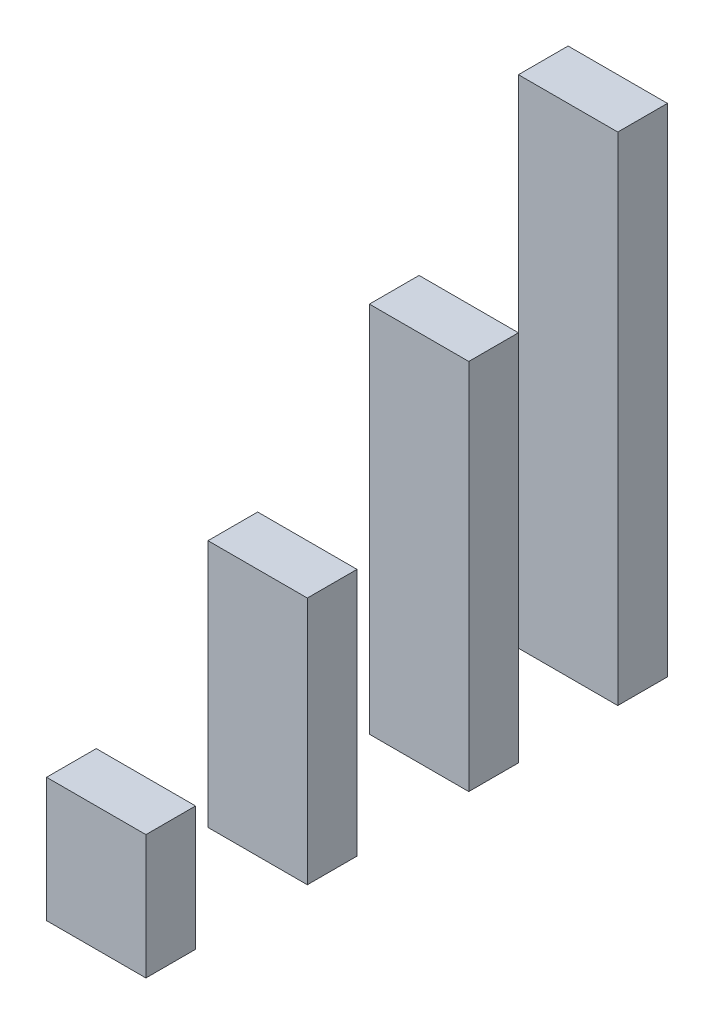
ISO-10303-21;
HEADER;
FILE_DESCRIPTION(('STEP AP214'),'2;1');
FILE_NAME('part.step','',(''),(''),'','','');
FILE_SCHEMA(('AUTOMOTIVE_DESIGN { 1 0 10303 214 1 1 1 1 }'));
ENDSEC;
DATA;
#1=APPLICATION_CONTEXT('core data for automotive mechanical design processes');
#2=APPLICATION_PROTOCOL_DEFINITION('international standard','automotive_design',2000,#1);
#3=PRODUCT_CONTEXT('',#1,'mechanical');
#4=PRODUCT('Part','Part','',(#3));
#5=PRODUCT_RELATED_PRODUCT_CATEGORY('part','',(#4));
#6=PRODUCT_DEFINITION_FORMATION('','',#4);
#7=PRODUCT_DEFINITION_CONTEXT('part definition',#1,'design');
#8=PRODUCT_DEFINITION('design','',#6,#7);
#9=PRODUCT_DEFINITION_SHAPE('','',#8);
#10=(LENGTH_UNIT() NAMED_UNIT(*) SI_UNIT(.MILLI.,.METRE.));
#11=(NAMED_UNIT(*) PLANE_ANGLE_UNIT() SI_UNIT($,.RADIAN.));
#12=(NAMED_UNIT(*) SI_UNIT($,.STERADIAN.) SOLID_ANGLE_UNIT());
#13=UNCERTAINTY_MEASURE_WITH_UNIT(LENGTH_MEASURE(1.E-05),#10,'distance_accuracy_value','');
#14=(GEOMETRIC_REPRESENTATION_CONTEXT(3) GLOBAL_UNCERTAINTY_ASSIGNED_CONTEXT((#13)) GLOBAL_UNIT_ASSIGNED_CONTEXT((#10,
#11,#12)) REPRESENTATION_CONTEXT('',''));
#15=CARTESIAN_POINT('',(0.,0.,0.));
#16=DIRECTION('',(0.,0.,1.));
#17=DIRECTION('',(1.,0.,0.));
#18=AXIS2_PLACEMENT_3D('',#15,#16,#17);
#19=CARTESIAN_POINT('',(-4.00000000000001,41.,-21.));
#20=DIRECTION('',(1.,0.,0.));
#21=DIRECTION('',(0.,0.,-1.));
#22=AXIS2_PLACEMENT_3D('',#19,#20,#21);
#23=PLANE('',#22);
#24=DIRECTION('',(0.,0.,1.));
#25=VECTOR('',#24,1.);
#26=CARTESIAN_POINT('',(-4.00000000000001,1.,-21.));
#27=LINE('',#26,#25);
#28=CARTESIAN_POINT('',(-4.00000000000001,1.,-21.));
#29=VERTEX_POINT('',#28);
#30=CARTESIAN_POINT('',(-4.00000000000001,1.,-17.));
#31=VERTEX_POINT('',#30);
#32=EDGE_CURVE('E109',#29,#31,#27,.T.);
#33=ORIENTED_EDGE('',*,*,#32,.T.);
#34=DIRECTION('',(0.,-1.,0.));
#35=VECTOR('',#34,1.);
#36=CARTESIAN_POINT('',(-4.00000000000001,41.,-17.));
#37=LINE('',#36,#35);
#38=CARTESIAN_POINT('',(-4.00000000000001,41.,-17.));
#39=VERTEX_POINT('',#38);
#40=EDGE_CURVE('E12',#39,#31,#37,.T.);
#41=ORIENTED_EDGE('',*,*,#40,.F.);
#42=DIRECTION('',(0.,0.,1.));
#43=VECTOR('',#42,1.);
#44=CARTESIAN_POINT('',(-4.00000000000001,41.,-21.));
#45=LINE('',#44,#43);
#46=CARTESIAN_POINT('',(-4.00000000000001,41.,-21.));
#47=VERTEX_POINT('',#46);
#48=EDGE_CURVE('E97',#47,#39,#45,.T.);
#49=ORIENTED_EDGE('',*,*,#48,.F.);
#50=DIRECTION('',(0.,-1.,0.));
#51=VECTOR('',#50,1.);
#52=CARTESIAN_POINT('',(-4.00000000000001,41.,-21.));
#53=LINE('',#52,#51);
#54=EDGE_CURVE('E105',#47,#29,#53,.T.);
#55=ORIENTED_EDGE('',*,*,#54,.T.);
#56=EDGE_LOOP('',(#33,#41,#49,#55));
#57=FACE_BOUND('',#56,.T.);
#58=ADVANCED_FACE('F46',(#57),#23,.F.);
#59=CARTESIAN_POINT('',(-4.00000000000001,41.,-17.));
#60=DIRECTION('',(0.,0.,-1.));
#61=DIRECTION('',(-1.,0.,0.));
#62=AXIS2_PLACEMENT_3D('',#59,#60,#61);
#63=PLANE('',#62);
#64=DIRECTION('',(1.,0.,0.));
#65=VECTOR('',#64,1.);
#66=CARTESIAN_POINT('',(-4.00000000000001,1.,-17.));
#67=LINE('',#66,#65);
#68=CARTESIAN_POINT('',(3.99999999999999,1.,-17.));
#69=VERTEX_POINT('',#68);
#70=EDGE_CURVE('E101',#31,#69,#67,.T.);
#71=ORIENTED_EDGE('',*,*,#70,.T.);
#72=DIRECTION('',(0.,-1.,0.));
#73=VECTOR('',#72,1.);
#74=CARTESIAN_POINT('',(3.99999999999999,41.,-17.));
#75=LINE('',#74,#73);
#76=CARTESIAN_POINT('',(3.99999999999999,41.,-17.));
#77=VERTEX_POINT('',#76);
#78=EDGE_CURVE('E54',#77,#69,#75,.T.);
#79=ORIENTED_EDGE('',*,*,#78,.F.);
#80=DIRECTION('',(1.,0.,0.));
#81=VECTOR('',#80,1.);
#82=CARTESIAN_POINT('',(-4.00000000000001,41.,-17.));
#83=LINE('',#82,#81);
#84=EDGE_CURVE('E92',#39,#77,#83,.T.);
#85=ORIENTED_EDGE('',*,*,#84,.F.);
#86=ORIENTED_EDGE('',*,*,#40,.T.);
#87=EDGE_LOOP('',(#71,#79,#85,#86));
#88=FACE_BOUND('',#87,.T.);
#89=ADVANCED_FACE('F100',(#88),#63,.F.);
#90=CARTESIAN_POINT('',(3.99999999999999,41.,-21.));
#91=DIRECTION('',(-1.,0.,0.));
#92=DIRECTION('',(0.,0.,1.));
#93=AXIS2_PLACEMENT_3D('',#90,#91,#92);
#94=PLANE('',#93);
#95=DIRECTION('',(0.,0.,-1.));
#96=VECTOR('',#95,1.);
#97=CARTESIAN_POINT('',(3.99999999999999,1.,-21.));
#98=LINE('',#97,#96);
#99=CARTESIAN_POINT('',(3.99999999999999,1.,-21.));
#100=VERTEX_POINT('',#99);
#101=EDGE_CURVE('E79',#69,#100,#98,.T.);
#102=ORIENTED_EDGE('',*,*,#101,.T.);
#103=DIRECTION('',(0.,-1.,0.));
#104=VECTOR('',#103,1.);
#105=CARTESIAN_POINT('',(3.99999999999999,41.,-21.));
#106=LINE('',#105,#104);
#107=CARTESIAN_POINT('',(3.99999999999999,41.,-21.));
#108=VERTEX_POINT('',#107);
#109=EDGE_CURVE('E102',#108,#100,#106,.T.);
#110=ORIENTED_EDGE('',*,*,#109,.F.);
#111=DIRECTION('',(0.,0.,-1.));
#112=VECTOR('',#111,1.);
#113=CARTESIAN_POINT('',(3.99999999999999,41.,-21.));
#114=LINE('',#113,#112);
#115=EDGE_CURVE('E95',#77,#108,#114,.T.);
#116=ORIENTED_EDGE('',*,*,#115,.F.);
#117=ORIENTED_EDGE('',*,*,#78,.T.);
#118=EDGE_LOOP('',(#102,#110,#116,#117));
#119=FACE_BOUND('',#118,.T.);
#120=ADVANCED_FACE('F103',(#119),#94,.F.);
#121=CARTESIAN_POINT('',(-4.00000000000001,41.,-21.));
#122=DIRECTION('',(0.,0.,1.));
#123=DIRECTION('',(1.,0.,0.));
#124=AXIS2_PLACEMENT_3D('',#121,#122,#123);
#125=PLANE('',#124);
#126=DIRECTION('',(-1.,0.,0.));
#127=VECTOR('',#126,1.);
#128=CARTESIAN_POINT('',(-4.00000000000001,1.,-21.));
#129=LINE('',#128,#127);
#130=EDGE_CURVE('E85',#100,#29,#129,.T.);
#131=ORIENTED_EDGE('',*,*,#130,.T.);
#132=ORIENTED_EDGE('',*,*,#54,.F.);
#133=DIRECTION('',(-1.,0.,0.));
#134=VECTOR('',#133,1.);
#135=CARTESIAN_POINT('',(-4.00000000000001,41.,-21.));
#136=LINE('',#135,#134);
#137=EDGE_CURVE('E62',#108,#47,#136,.T.);
#138=ORIENTED_EDGE('',*,*,#137,.F.);
#139=ORIENTED_EDGE('',*,*,#109,.T.);
#140=EDGE_LOOP('',(#131,#132,#138,#139));
#141=FACE_BOUND('',#140,.T.);
#142=ADVANCED_FACE('F116',(#141),#125,.F.);
#143=CARTESIAN_POINT('',(0.,41.,0.));
#144=DIRECTION('',(0.,1.,0.));
#145=DIRECTION('',(0.,0.,1.));
#146=AXIS2_PLACEMENT_3D('',#143,#144,#145);
#147=PLANE('',#146);
#148=ORIENTED_EDGE('',*,*,#48,.T.);
#149=ORIENTED_EDGE('',*,*,#84,.T.);
#150=ORIENTED_EDGE('',*,*,#115,.T.);
#151=ORIENTED_EDGE('',*,*,#137,.T.);
#152=EDGE_LOOP('',(#148,#149,#150,#151));
#153=FACE_BOUND('',#152,.T.);
#154=ADVANCED_FACE('F93',(#153),#147,.T.);
#155=CARTESIAN_POINT('',(0.,1.,0.));
#156=DIRECTION('',(0.,1.,0.));
#157=DIRECTION('',(0.,0.,1.));
#158=AXIS2_PLACEMENT_3D('',#155,#156,#157);
#159=PLANE('',#158);
#160=ORIENTED_EDGE('',*,*,#32,.F.);
#161=ORIENTED_EDGE('',*,*,#130,.F.);
#162=ORIENTED_EDGE('',*,*,#101,.F.);
#163=ORIENTED_EDGE('',*,*,#70,.F.);
#164=EDGE_LOOP('',(#160,#161,#162,#163));
#165=FACE_BOUND('',#164,.T.);
#166=ADVANCED_FACE('F119',(#165),#159,.F.);
#167=CLOSED_SHELL('',(#58,#89,#120,#142,#154,#166));
#168=MANIFOLD_SOLID_BREP('B2',#167);
#169=CARTESIAN_POINT('',(-4.00000000000001,31.,-9.));
#170=DIRECTION('',(1.,0.,0.));
#171=DIRECTION('',(0.,0.,-1.));
#172=AXIS2_PLACEMENT_3D('',#169,#170,#171);
#173=PLANE('',#172);
#174=DIRECTION('',(0.,0.,1.));
#175=VECTOR('',#174,1.);
#176=CARTESIAN_POINT('',(-4.00000000000001,1.,-9.));
#177=LINE('',#176,#175);
#178=CARTESIAN_POINT('',(-4.00000000000001,1.,-9.));
#179=VERTEX_POINT('',#178);
#180=CARTESIAN_POINT('',(-4.00000000000001,1.,-5.));
#181=VERTEX_POINT('',#180);
#182=EDGE_CURVE('E243',#179,#181,#177,.T.);
#183=ORIENTED_EDGE('',*,*,#182,.T.);
#184=DIRECTION('',(0.,-1.,0.));
#185=VECTOR('',#184,1.);
#186=CARTESIAN_POINT('',(-4.00000000000001,31.,-5.));
#187=LINE('',#186,#185);
#188=CARTESIAN_POINT('',(-4.00000000000001,31.,-5.));
#189=VERTEX_POINT('',#188);
#190=EDGE_CURVE('E44',#189,#181,#187,.T.);
#191=ORIENTED_EDGE('',*,*,#190,.F.);
#192=DIRECTION('',(0.,0.,1.));
#193=VECTOR('',#192,1.);
#194=CARTESIAN_POINT('',(-4.00000000000001,31.,-9.));
#195=LINE('',#194,#193);
#196=CARTESIAN_POINT('',(-4.00000000000001,31.,-9.));
#197=VERTEX_POINT('',#196);
#198=EDGE_CURVE('E231',#197,#189,#195,.T.);
#199=ORIENTED_EDGE('',*,*,#198,.F.);
#200=DIRECTION('',(0.,-1.,0.));
#201=VECTOR('',#200,1.);
#202=CARTESIAN_POINT('',(-4.00000000000001,31.,-9.));
#203=LINE('',#202,#201);
#204=EDGE_CURVE('E239',#197,#179,#203,.T.);
#205=ORIENTED_EDGE('',*,*,#204,.T.);
#206=EDGE_LOOP('',(#183,#191,#199,#205));
#207=FACE_BOUND('',#206,.T.);
#208=ADVANCED_FACE('F180',(#207),#173,.F.);
#209=CARTESIAN_POINT('',(-4.00000000000001,31.,-5.));
#210=DIRECTION('',(0.,0.,-1.));
#211=DIRECTION('',(-1.,0.,0.));
#212=AXIS2_PLACEMENT_3D('',#209,#210,#211);
#213=PLANE('',#212);
#214=DIRECTION('',(1.,0.,0.));
#215=VECTOR('',#214,1.);
#216=CARTESIAN_POINT('',(-4.00000000000001,1.,-5.));
#217=LINE('',#216,#215);
#218=CARTESIAN_POINT('',(4.,1.,-5.));
#219=VERTEX_POINT('',#218);
#220=EDGE_CURVE('E235',#181,#219,#217,.T.);
#221=ORIENTED_EDGE('',*,*,#220,.T.);
#222=DIRECTION('',(0.,-1.,0.));
#223=VECTOR('',#222,1.);
#224=CARTESIAN_POINT('',(4.,31.,-5.));
#225=LINE('',#224,#223);
#226=CARTESIAN_POINT('',(4.,31.,-5.));
#227=VERTEX_POINT('',#226);
#228=EDGE_CURVE('E188',#227,#219,#225,.T.);
#229=ORIENTED_EDGE('',*,*,#228,.F.);
#230=DIRECTION('',(1.,0.,0.));
#231=VECTOR('',#230,1.);
#232=CARTESIAN_POINT('',(-4.00000000000001,31.,-5.));
#233=LINE('',#232,#231);
#234=EDGE_CURVE('E226',#189,#227,#233,.T.);
#235=ORIENTED_EDGE('',*,*,#234,.F.);
#236=ORIENTED_EDGE('',*,*,#190,.T.);
#237=EDGE_LOOP('',(#221,#229,#235,#236));
#238=FACE_BOUND('',#237,.T.);
#239=ADVANCED_FACE('F234',(#238),#213,.F.);
#240=CARTESIAN_POINT('',(3.99999999999999,31.,-9.));
#241=DIRECTION('',(-1.,0.,0.));
#242=DIRECTION('',(0.,0.,1.));
#243=AXIS2_PLACEMENT_3D('',#240,#241,#242);
#244=PLANE('',#243);
#245=DIRECTION('',(0.,0.,-1.));
#246=VECTOR('',#245,1.);
#247=CARTESIAN_POINT('',(3.99999999999999,1.,-9.));
#248=LINE('',#247,#246);
#249=CARTESIAN_POINT('',(3.99999999999999,1.,-9.));
#250=VERTEX_POINT('',#249);
#251=EDGE_CURVE('E213',#219,#250,#248,.T.);
#252=ORIENTED_EDGE('',*,*,#251,.T.);
#253=DIRECTION('',(0.,-1.,0.));
#254=VECTOR('',#253,1.);
#255=CARTESIAN_POINT('',(3.99999999999999,31.,-9.));
#256=LINE('',#255,#254);
#257=CARTESIAN_POINT('',(3.99999999999999,31.,-9.));
#258=VERTEX_POINT('',#257);
#259=EDGE_CURVE('E236',#258,#250,#256,.T.);
#260=ORIENTED_EDGE('',*,*,#259,.F.);
#261=DIRECTION('',(0.,0.,-1.));
#262=VECTOR('',#261,1.);
#263=CARTESIAN_POINT('',(3.99999999999999,31.,-9.));
#264=LINE('',#263,#262);
#265=EDGE_CURVE('E229',#227,#258,#264,.T.);
#266=ORIENTED_EDGE('',*,*,#265,.F.);
#267=ORIENTED_EDGE('',*,*,#228,.T.);
#268=EDGE_LOOP('',(#252,#260,#266,#267));
#269=FACE_BOUND('',#268,.T.);
#270=ADVANCED_FACE('F237',(#269),#244,.F.);
#271=CARTESIAN_POINT('',(-4.00000000000001,31.,-9.));
#272=DIRECTION('',(0.,0.,1.));
#273=DIRECTION('',(1.,0.,0.));
#274=AXIS2_PLACEMENT_3D('',#271,#272,#273);
#275=PLANE('',#274);
#276=DIRECTION('',(-1.,0.,0.));
#277=VECTOR('',#276,1.);
#278=CARTESIAN_POINT('',(-4.00000000000001,1.,-9.));
#279=LINE('',#278,#277);
#280=EDGE_CURVE('E219',#250,#179,#279,.T.);
#281=ORIENTED_EDGE('',*,*,#280,.T.);
#282=ORIENTED_EDGE('',*,*,#204,.F.);
#283=DIRECTION('',(-1.,0.,0.));
#284=VECTOR('',#283,1.);
#285=CARTESIAN_POINT('',(-4.00000000000001,31.,-9.));
#286=LINE('',#285,#284);
#287=EDGE_CURVE('E196',#258,#197,#286,.T.);
#288=ORIENTED_EDGE('',*,*,#287,.F.);
#289=ORIENTED_EDGE('',*,*,#259,.T.);
#290=EDGE_LOOP('',(#281,#282,#288,#289));
#291=FACE_BOUND('',#290,.T.);
#292=ADVANCED_FACE('F250',(#291),#275,.F.);
#293=CARTESIAN_POINT('',(0.,31.,0.));
#294=DIRECTION('',(0.,1.,0.));
#295=DIRECTION('',(0.,0.,1.));
#296=AXIS2_PLACEMENT_3D('',#293,#294,#295);
#297=PLANE('',#296);
#298=ORIENTED_EDGE('',*,*,#198,.T.);
#299=ORIENTED_EDGE('',*,*,#234,.T.);
#300=ORIENTED_EDGE('',*,*,#265,.T.);
#301=ORIENTED_EDGE('',*,*,#287,.T.);
#302=EDGE_LOOP('',(#298,#299,#300,#301));
#303=FACE_BOUND('',#302,.T.);
#304=ADVANCED_FACE('F227',(#303),#297,.T.);
#305=CARTESIAN_POINT('',(0.,1.,0.));
#306=DIRECTION('',(0.,1.,0.));
#307=DIRECTION('',(0.,0.,1.));
#308=AXIS2_PLACEMENT_3D('',#305,#306,#307);
#309=PLANE('',#308);
#310=ORIENTED_EDGE('',*,*,#182,.F.);
#311=ORIENTED_EDGE('',*,*,#280,.F.);
#312=ORIENTED_EDGE('',*,*,#251,.F.);
#313=ORIENTED_EDGE('',*,*,#220,.F.);
#314=EDGE_LOOP('',(#310,#311,#312,#313));
#315=FACE_BOUND('',#314,.T.);
#316=ADVANCED_FACE('F253',(#315),#309,.F.);
#317=CLOSED_SHELL('',(#208,#239,#270,#292,#304,#316));
#318=MANIFOLD_SOLID_BREP('B6',#317);
#319=CARTESIAN_POINT('',(-4.00000000000001,21.,4.));
#320=DIRECTION('',(1.,0.,0.));
#321=DIRECTION('',(0.,0.,-1.));
#322=AXIS2_PLACEMENT_3D('',#319,#320,#321);
#323=PLANE('',#322);
#324=DIRECTION('',(0.,0.,1.));
#325=VECTOR('',#324,1.);
#326=CARTESIAN_POINT('',(-4.00000000000001,1.,4.));
#327=LINE('',#326,#325);
#328=CARTESIAN_POINT('',(-4.00000000000001,1.,4.));
#329=VERTEX_POINT('',#328);
#330=CARTESIAN_POINT('',(-4.00000000000001,1.,8.));
#331=VERTEX_POINT('',#330);
#332=EDGE_CURVE('E376',#329,#331,#327,.T.);
#333=ORIENTED_EDGE('',*,*,#332,.T.);
#334=DIRECTION('',(0.,-1.,0.));
#335=VECTOR('',#334,1.);
#336=CARTESIAN_POINT('',(-4.00000000000001,21.,8.));
#337=LINE('',#336,#335);
#338=CARTESIAN_POINT('',(-4.00000000000001,21.,8.));
#339=VERTEX_POINT('',#338);
#340=EDGE_CURVE('E178',#339,#331,#337,.T.);
#341=ORIENTED_EDGE('',*,*,#340,.F.);
#342=DIRECTION('',(0.,0.,1.));
#343=VECTOR('',#342,1.);
#344=CARTESIAN_POINT('',(-4.00000000000001,21.,4.));
#345=LINE('',#344,#343);
#346=CARTESIAN_POINT('',(-4.00000000000001,21.,4.));
#347=VERTEX_POINT('',#346);
#348=EDGE_CURVE('E364',#347,#339,#345,.T.);
#349=ORIENTED_EDGE('',*,*,#348,.F.);
#350=DIRECTION('',(0.,-1.,0.));
#351=VECTOR('',#350,1.);
#352=CARTESIAN_POINT('',(-4.00000000000001,21.,4.));
#353=LINE('',#352,#351);
#354=EDGE_CURVE('E372',#347,#329,#353,.T.);
#355=ORIENTED_EDGE('',*,*,#354,.T.);
#356=EDGE_LOOP('',(#333,#341,#349,#355));
#357=FACE_BOUND('',#356,.T.);
#358=ADVANCED_FACE('F313',(#357),#323,.F.);
#359=CARTESIAN_POINT('',(-4.00000000000001,21.,8.));
#360=DIRECTION('',(0.,0.,-1.));
#361=DIRECTION('',(-1.,0.,0.));
#362=AXIS2_PLACEMENT_3D('',#359,#360,#361);
#363=PLANE('',#362);
#364=DIRECTION('',(1.,0.,0.));
#365=VECTOR('',#364,1.);
#366=CARTESIAN_POINT('',(-4.00000000000001,1.,8.));
#367=LINE('',#366,#365);
#368=CARTESIAN_POINT('',(3.99999999999999,1.,8.));
#369=VERTEX_POINT('',#368);
#370=EDGE_CURVE('E368',#331,#369,#367,.T.);
#371=ORIENTED_EDGE('',*,*,#370,.T.);
#372=DIRECTION('',(0.,-1.,0.));
#373=VECTOR('',#372,1.);
#374=CARTESIAN_POINT('',(3.99999999999999,21.,8.));
#375=LINE('',#374,#373);
#376=CARTESIAN_POINT('',(3.99999999999999,21.,8.));
#377=VERTEX_POINT('',#376);
#378=EDGE_CURVE('E321',#377,#369,#375,.T.);
#379=ORIENTED_EDGE('',*,*,#378,.F.);
#380=DIRECTION('',(1.,0.,0.));
#381=VECTOR('',#380,1.);
#382=CARTESIAN_POINT('',(-4.00000000000001,21.,8.));
#383=LINE('',#382,#381);
#384=EDGE_CURVE('E359',#339,#377,#383,.T.);
#385=ORIENTED_EDGE('',*,*,#384,.F.);
#386=ORIENTED_EDGE('',*,*,#340,.T.);
#387=EDGE_LOOP('',(#371,#379,#385,#386));
#388=FACE_BOUND('',#387,.T.);
#389=ADVANCED_FACE('F367',(#388),#363,.F.);
#390=CARTESIAN_POINT('',(3.99999999999999,21.,4.));
#391=DIRECTION('',(-1.,0.,0.));
#392=DIRECTION('',(0.,0.,1.));
#393=AXIS2_PLACEMENT_3D('',#390,#391,#392);
#394=PLANE('',#393);
#395=DIRECTION('',(0.,0.,-1.));
#396=VECTOR('',#395,1.);
#397=CARTESIAN_POINT('',(3.99999999999999,1.,4.));
#398=LINE('',#397,#396);
#399=CARTESIAN_POINT('',(3.99999999999999,1.,4.));
#400=VERTEX_POINT('',#399);
#401=EDGE_CURVE('E346',#369,#400,#398,.T.);
#402=ORIENTED_EDGE('',*,*,#401,.T.);
#403=DIRECTION('',(0.,-1.,0.));
#404=VECTOR('',#403,1.);
#405=CARTESIAN_POINT('',(3.99999999999999,21.,4.));
#406=LINE('',#405,#404);
#407=CARTESIAN_POINT('',(3.99999999999999,21.,4.));
#408=VERTEX_POINT('',#407);
#409=EDGE_CURVE('E369',#408,#400,#406,.T.);
#410=ORIENTED_EDGE('',*,*,#409,.F.);
#411=DIRECTION('',(0.,0.,-1.));
#412=VECTOR('',#411,1.);
#413=CARTESIAN_POINT('',(3.99999999999999,21.,4.));
#414=LINE('',#413,#412);
#415=EDGE_CURVE('E362',#377,#408,#414,.T.);
#416=ORIENTED_EDGE('',*,*,#415,.F.);
#417=ORIENTED_EDGE('',*,*,#378,.T.);
#418=EDGE_LOOP('',(#402,#410,#416,#417));
#419=FACE_BOUND('',#418,.T.);
#420=ADVANCED_FACE('F370',(#419),#394,.F.);
#421=CARTESIAN_POINT('',(-4.00000000000001,21.,4.));
#422=DIRECTION('',(0.,0.,1.));
#423=DIRECTION('',(1.,0.,0.));
#424=AXIS2_PLACEMENT_3D('',#421,#422,#423);
#425=PLANE('',#424);
#426=DIRECTION('',(-1.,0.,0.));
#427=VECTOR('',#426,1.);
#428=CARTESIAN_POINT('',(-4.00000000000001,1.,4.));
#429=LINE('',#428,#427);
#430=EDGE_CURVE('E352',#400,#329,#429,.T.);
#431=ORIENTED_EDGE('',*,*,#430,.T.);
#432=ORIENTED_EDGE('',*,*,#354,.F.);
#433=DIRECTION('',(-1.,0.,0.));
#434=VECTOR('',#433,1.);
#435=CARTESIAN_POINT('',(-4.00000000000001,21.,4.));
#436=LINE('',#435,#434);
#437=EDGE_CURVE('E329',#408,#347,#436,.T.);
#438=ORIENTED_EDGE('',*,*,#437,.F.);
#439=ORIENTED_EDGE('',*,*,#409,.T.);
#440=EDGE_LOOP('',(#431,#432,#438,#439));
#441=FACE_BOUND('',#440,.T.);
#442=ADVANCED_FACE('F383',(#441),#425,.F.);
#443=CARTESIAN_POINT('',(0.,21.,0.));
#444=DIRECTION('',(0.,1.,0.));
#445=DIRECTION('',(0.,0.,1.));
#446=AXIS2_PLACEMENT_3D('',#443,#444,#445);
#447=PLANE('',#446);
#448=ORIENTED_EDGE('',*,*,#348,.T.);
#449=ORIENTED_EDGE('',*,*,#384,.T.);
#450=ORIENTED_EDGE('',*,*,#415,.T.);
#451=ORIENTED_EDGE('',*,*,#437,.T.);
#452=EDGE_LOOP('',(#448,#449,#450,#451));
#453=FACE_BOUND('',#452,.T.);
#454=ADVANCED_FACE('F360',(#453),#447,.T.);
#455=CARTESIAN_POINT('',(0.,1.,0.));
#456=DIRECTION('',(0.,1.,0.));
#457=DIRECTION('',(0.,0.,1.));
#458=AXIS2_PLACEMENT_3D('',#455,#456,#457);
#459=PLANE('',#458);
#460=ORIENTED_EDGE('',*,*,#332,.F.);
#461=ORIENTED_EDGE('',*,*,#430,.F.);
#462=ORIENTED_EDGE('',*,*,#401,.F.);
#463=ORIENTED_EDGE('',*,*,#370,.F.);
#464=EDGE_LOOP('',(#460,#461,#462,#463));
#465=FACE_BOUND('',#464,.T.);
#466=ADVANCED_FACE('F386',(#465),#459,.F.);
#467=CLOSED_SHELL('',(#358,#389,#420,#442,#454,#466));
#468=MANIFOLD_SOLID_BREP('B38',#467);
#469=CARTESIAN_POINT('',(3.99999999999999,11.,21.));
#470=DIRECTION('',(-1.,0.,0.));
#471=DIRECTION('',(0.,0.,1.));
#472=AXIS2_PLACEMENT_3D('',#469,#470,#471);
#473=PLANE('',#472);
#474=DIRECTION('',(0.,0.,-1.));
#475=VECTOR('',#474,1.);
#476=CARTESIAN_POINT('',(3.99999999999999,1.,21.));
#477=LINE('',#476,#475);
#478=CARTESIAN_POINT('',(3.99999999999999,1.,21.));
#479=VERTEX_POINT('',#478);
#480=CARTESIAN_POINT('',(3.99999999999999,1.,17.));
#481=VERTEX_POINT('',#480);
#482=EDGE_CURVE('E500',#479,#481,#477,.T.);
#483=ORIENTED_EDGE('',*,*,#482,.T.);
#484=DIRECTION('',(0.,-1.,0.));
#485=VECTOR('',#484,1.);
#486=CARTESIAN_POINT('',(3.99999999999999,11.,17.));
#487=LINE('',#486,#485);
#488=CARTESIAN_POINT('',(3.99999999999999,11.,17.));
#489=VERTEX_POINT('',#488);
#490=EDGE_CURVE('E311',#489,#481,#487,.T.);
#491=ORIENTED_EDGE('',*,*,#490,.F.);
#492=DIRECTION('',(0.,0.,-1.));
#493=VECTOR('',#492,1.);
#494=CARTESIAN_POINT('',(3.99999999999999,11.,21.));
#495=LINE('',#494,#493);
#496=CARTESIAN_POINT('',(3.99999999999999,11.,21.));
#497=VERTEX_POINT('',#496);
#498=EDGE_CURVE('E488',#497,#489,#495,.T.);
#499=ORIENTED_EDGE('',*,*,#498,.F.);
#500=DIRECTION('',(0.,-1.,0.));
#501=VECTOR('',#500,1.);
#502=CARTESIAN_POINT('',(3.99999999999999,11.,21.));
#503=LINE('',#502,#501);
#504=EDGE_CURVE('E496',#497,#479,#503,.T.);
#505=ORIENTED_EDGE('',*,*,#504,.T.);
#506=EDGE_LOOP('',(#483,#491,#499,#505));
#507=FACE_BOUND('',#506,.T.);
#508=ADVANCED_FACE('F437',(#507),#473,.F.);
#509=CARTESIAN_POINT('',(3.99999999999999,11.,17.));
#510=DIRECTION('',(0.,0.,1.));
#511=DIRECTION('',(1.,0.,0.));
#512=AXIS2_PLACEMENT_3D('',#509,#510,#511);
#513=PLANE('',#512);
#514=DIRECTION('',(-1.,0.,0.));
#515=VECTOR('',#514,1.);
#516=CARTESIAN_POINT('',(3.99999999999999,1.,17.));
#517=LINE('',#516,#515);
#518=CARTESIAN_POINT('',(-4.00000000000001,1.,17.));
#519=VERTEX_POINT('',#518);
#520=EDGE_CURVE('E492',#481,#519,#517,.T.);
#521=ORIENTED_EDGE('',*,*,#520,.T.);
#522=DIRECTION('',(0.,-1.,0.));
#523=VECTOR('',#522,1.);
#524=CARTESIAN_POINT('',(-4.00000000000001,11.,17.));
#525=LINE('',#524,#523);
#526=CARTESIAN_POINT('',(-4.00000000000001,11.,17.));
#527=VERTEX_POINT('',#526);
#528=EDGE_CURVE('E445',#527,#519,#525,.T.);
#529=ORIENTED_EDGE('',*,*,#528,.F.);
#530=DIRECTION('',(-1.,0.,0.));
#531=VECTOR('',#530,1.);
#532=CARTESIAN_POINT('',(3.99999999999999,11.,17.));
#533=LINE('',#532,#531);
#534=EDGE_CURVE('E483',#489,#527,#533,.T.);
#535=ORIENTED_EDGE('',*,*,#534,.F.);
#536=ORIENTED_EDGE('',*,*,#490,.T.);
#537=EDGE_LOOP('',(#521,#529,#535,#536));
#538=FACE_BOUND('',#537,.T.);
#539=ADVANCED_FACE('F491',(#538),#513,.F.);
#540=CARTESIAN_POINT('',(-4.00000000000001,11.,21.));
#541=DIRECTION('',(1.,0.,0.));
#542=DIRECTION('',(0.,0.,-1.));
#543=AXIS2_PLACEMENT_3D('',#540,#541,#542);
#544=PLANE('',#543);
#545=DIRECTION('',(0.,0.,1.));
#546=VECTOR('',#545,1.);
#547=CARTESIAN_POINT('',(-4.00000000000001,1.,21.));
#548=LINE('',#547,#546);
#549=CARTESIAN_POINT('',(-4.00000000000001,1.,21.));
#550=VERTEX_POINT('',#549);
#551=EDGE_CURVE('E470',#519,#550,#548,.T.);
#552=ORIENTED_EDGE('',*,*,#551,.T.);
#553=DIRECTION('',(0.,-1.,0.));
#554=VECTOR('',#553,1.);
#555=CARTESIAN_POINT('',(-4.00000000000001,11.,21.));
#556=LINE('',#555,#554);
#557=CARTESIAN_POINT('',(-4.00000000000001,11.,21.));
#558=VERTEX_POINT('',#557);
#559=EDGE_CURVE('E493',#558,#550,#556,.T.);
#560=ORIENTED_EDGE('',*,*,#559,.F.);
#561=DIRECTION('',(0.,0.,1.));
#562=VECTOR('',#561,1.);
#563=CARTESIAN_POINT('',(-4.00000000000001,11.,21.));
#564=LINE('',#563,#562);
#565=EDGE_CURVE('E486',#527,#558,#564,.T.);
#566=ORIENTED_EDGE('',*,*,#565,.F.);
#567=ORIENTED_EDGE('',*,*,#528,.T.);
#568=EDGE_LOOP('',(#552,#560,#566,#567));
#569=FACE_BOUND('',#568,.T.);
#570=ADVANCED_FACE('F494',(#569),#544,.F.);
#571=CARTESIAN_POINT('',(3.99999999999999,11.,21.));
#572=DIRECTION('',(0.,0.,-1.));
#573=DIRECTION('',(-1.,0.,0.));
#574=AXIS2_PLACEMENT_3D('',#571,#572,#573);
#575=PLANE('',#574);
#576=DIRECTION('',(1.,0.,0.));
#577=VECTOR('',#576,1.);
#578=CARTESIAN_POINT('',(3.99999999999999,1.,21.));
#579=LINE('',#578,#577);
#580=EDGE_CURVE('E476',#550,#479,#579,.T.);
#581=ORIENTED_EDGE('',*,*,#580,.T.);
#582=ORIENTED_EDGE('',*,*,#504,.F.);
#583=DIRECTION('',(1.,0.,0.));
#584=VECTOR('',#583,1.);
#585=CARTESIAN_POINT('',(3.99999999999999,11.,21.));
#586=LINE('',#585,#584);
#587=EDGE_CURVE('E453',#558,#497,#586,.T.);
#588=ORIENTED_EDGE('',*,*,#587,.F.);
#589=ORIENTED_EDGE('',*,*,#559,.T.);
#590=EDGE_LOOP('',(#581,#582,#588,#589));
#591=FACE_BOUND('',#590,.T.);
#592=ADVANCED_FACE('F507',(#591),#575,.F.);
#593=CARTESIAN_POINT('',(0.,11.,0.));
#594=DIRECTION('',(0.,1.,0.));
#595=DIRECTION('',(0.,0.,1.));
#596=AXIS2_PLACEMENT_3D('',#593,#594,#595);
#597=PLANE('',#596);
#598=ORIENTED_EDGE('',*,*,#498,.T.);
#599=ORIENTED_EDGE('',*,*,#534,.T.);
#600=ORIENTED_EDGE('',*,*,#565,.T.);
#601=ORIENTED_EDGE('',*,*,#587,.T.);
#602=EDGE_LOOP('',(#598,#599,#600,#601));
#603=FACE_BOUND('',#602,.T.);
#604=ADVANCED_FACE('F484',(#603),#597,.T.);
#605=CARTESIAN_POINT('',(0.,1.,0.));
#606=DIRECTION('',(0.,1.,0.));
#607=DIRECTION('',(0.,0.,1.));
#608=AXIS2_PLACEMENT_3D('',#605,#606,#607);
#609=PLANE('',#608);
#610=ORIENTED_EDGE('',*,*,#482,.F.);
#611=ORIENTED_EDGE('',*,*,#580,.F.);
#612=ORIENTED_EDGE('',*,*,#551,.F.);
#613=ORIENTED_EDGE('',*,*,#520,.F.);
#614=EDGE_LOOP('',(#610,#611,#612,#613));
#615=FACE_BOUND('',#614,.T.);
#616=ADVANCED_FACE('F510',(#615),#609,.F.);
#617=CLOSED_SHELL('',(#508,#539,#570,#592,#604,#616));
#618=MANIFOLD_SOLID_BREP('B172',#617);
#619=ADVANCED_BREP_SHAPE_REPRESENTATION('',(#18,#168,#318,#468,#618),#14);
#620=SHAPE_DEFINITION_REPRESENTATION(#9,#619);
ENDSEC;
END-ISO-10303-21;
